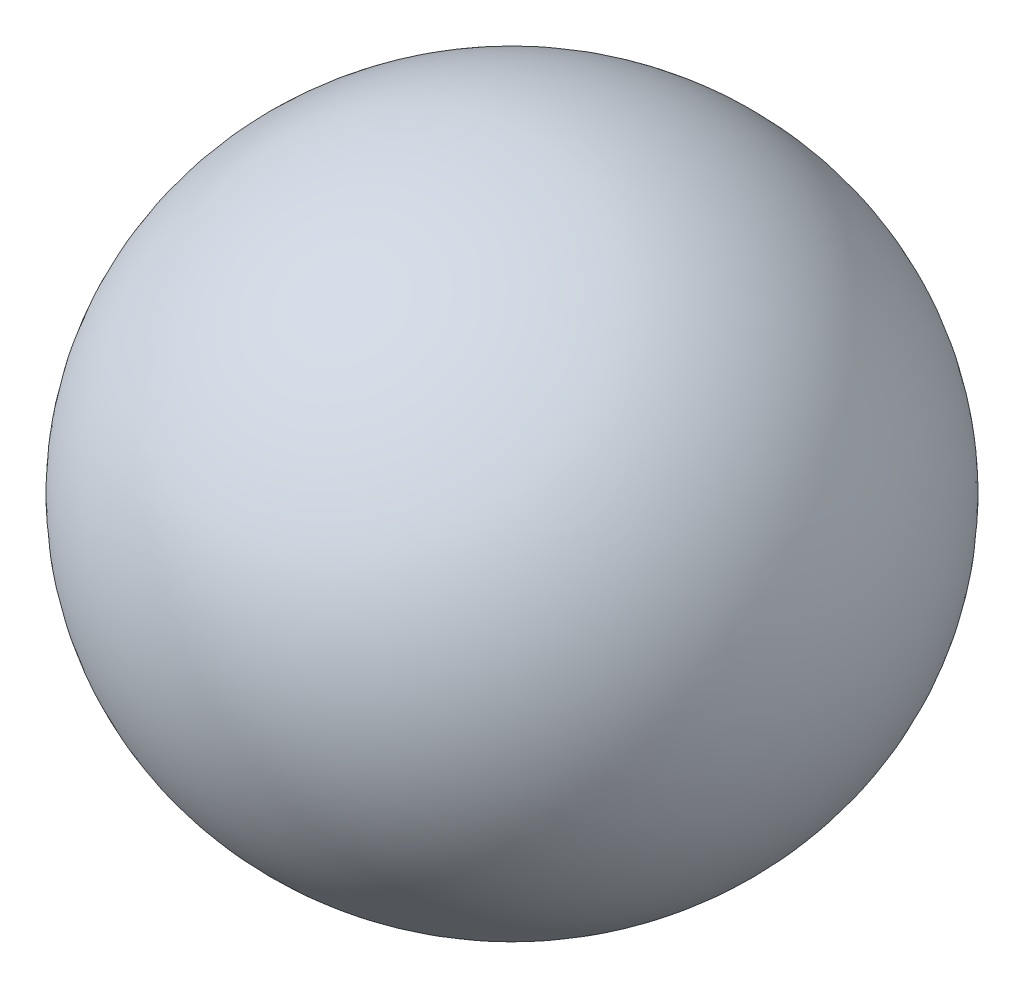
ISO-10303-21;
HEADER;
FILE_DESCRIPTION(('STEP AP214'),'2;1');
FILE_NAME('part.step','',(''),(''),'','','');
FILE_SCHEMA(('AUTOMOTIVE_DESIGN { 1 0 10303 214 1 1 1 1 }'));
ENDSEC;
DATA;
#1=APPLICATION_CONTEXT('core data for automotive mechanical design processes');
#2=APPLICATION_PROTOCOL_DEFINITION('international standard','automotive_design',2000,#1);
#3=PRODUCT_CONTEXT('',#1,'mechanical');
#4=PRODUCT('Part','Part','',(#3));
#5=PRODUCT_RELATED_PRODUCT_CATEGORY('part','',(#4));
#6=PRODUCT_DEFINITION_FORMATION('','',#4);
#7=PRODUCT_DEFINITION_CONTEXT('part definition',#1,'design');
#8=PRODUCT_DEFINITION('design','',#6,#7);
#9=PRODUCT_DEFINITION_SHAPE('','',#8);
#10=(LENGTH_UNIT() NAMED_UNIT(*) SI_UNIT(.MILLI.,.METRE.));
#11=(NAMED_UNIT(*) PLANE_ANGLE_UNIT() SI_UNIT($,.RADIAN.));
#12=(NAMED_UNIT(*) SI_UNIT($,.STERADIAN.) SOLID_ANGLE_UNIT());
#13=UNCERTAINTY_MEASURE_WITH_UNIT(LENGTH_MEASURE(1.E-05),#10,'distance_accuracy_value','');
#14=(GEOMETRIC_REPRESENTATION_CONTEXT(3) GLOBAL_UNCERTAINTY_ASSIGNED_CONTEXT((#13)) GLOBAL_UNIT_ASSIGNED_CONTEXT((#10,
#11,#12)) REPRESENTATION_CONTEXT('',''));
#15=CARTESIAN_POINT('',(0.,0.,0.));
#16=DIRECTION('',(0.,0.,1.));
#17=DIRECTION('',(1.,0.,0.));
#18=AXIS2_PLACEMENT_3D('',#15,#16,#17);
#19=CARTESIAN_POINT('',(0.,0.,0.));
#20=DIRECTION('',(0.,0.,1.));
#21=DIRECTION('',(1.,0.,0.));
#22=AXIS2_PLACEMENT_3D('',#19,#20,#21);
#23=ELLIPSE('',#22,43.18,40.64);
#24=TRIMMED_CURVE('',#23,(PARAMETER_VALUE(-1.5707963267949)),(PARAMETER_VALUE(1.5707963267949)),
.T.,.PARAMETER.);
#25=CARTESIAN_POINT('',(0.,0.,0.));
#26=DIRECTION('',(0.,-1.,0.));
#27=AXIS1_PLACEMENT('',#25,#26);
#28=SURFACE_OF_REVOLUTION('',#24,#27);
#29=CARTESIAN_POINT('',(0.,40.64,0.));
#30=VERTEX_POINT('',#29);
#31=VERTEX_LOOP('',#30);
#32=FACE_BOUND('',#31,.T.);
#33=CARTESIAN_POINT('',(0.,-40.64,0.));
#34=VERTEX_POINT('',#33);
#35=VERTEX_LOOP('',#34);
#36=FACE_BOUND('',#35,.T.);
#37=ADVANCED_FACE('F32',(#32,#36),#28,.F.);
#38=CLOSED_SHELL('',(#37));
#39=MANIFOLD_SOLID_BREP('B2',#38);
#40=ADVANCED_BREP_SHAPE_REPRESENTATION('',(#18,#39),#14);
#41=SHAPE_DEFINITION_REPRESENTATION(#9,#40);
ENDSEC;
END-ISO-10303-21;
